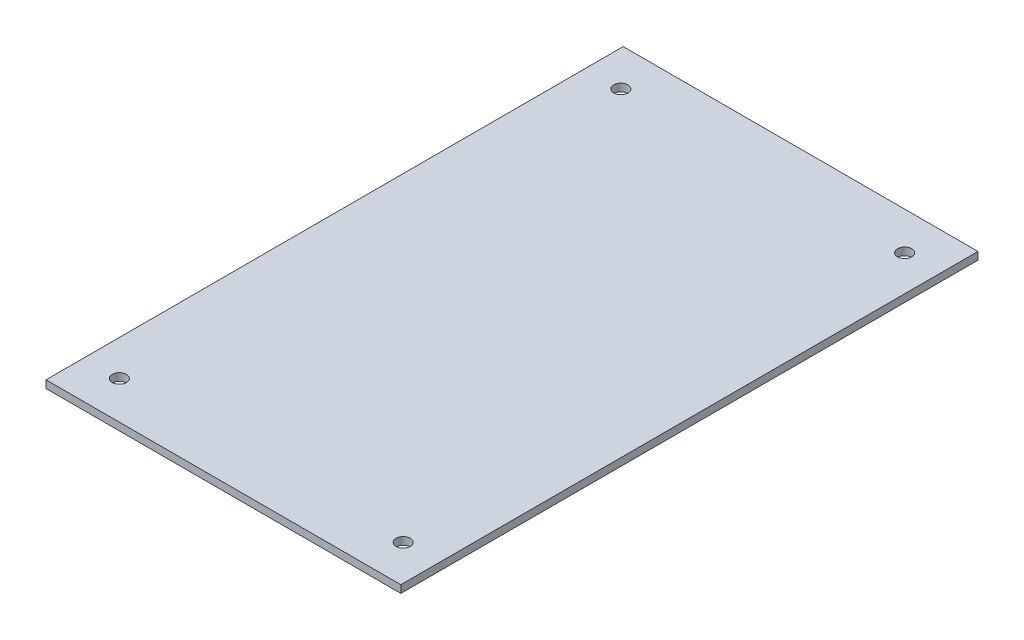
ISO-10303-21;
HEADER;
FILE_DESCRIPTION(('STEP AP214'),'2;1');
FILE_NAME('part.step','',(''),(''),'','','');
FILE_SCHEMA(('AUTOMOTIVE_DESIGN { 1 0 10303 214 1 1 1 1 }'));
ENDSEC;
DATA;
#1=APPLICATION_CONTEXT('core data for automotive mechanical design processes');
#2=APPLICATION_PROTOCOL_DEFINITION('international standard','automotive_design',2000,#1);
#3=PRODUCT_CONTEXT('',#1,'mechanical');
#4=PRODUCT('Part','Part','',(#3));
#5=PRODUCT_RELATED_PRODUCT_CATEGORY('part','',(#4));
#6=PRODUCT_DEFINITION_FORMATION('','',#4);
#7=PRODUCT_DEFINITION_CONTEXT('part definition',#1,'design');
#8=PRODUCT_DEFINITION('design','',#6,#7);
#9=PRODUCT_DEFINITION_SHAPE('','',#8);
#10=(LENGTH_UNIT() NAMED_UNIT(*) SI_UNIT(.MILLI.,.METRE.));
#11=(NAMED_UNIT(*) PLANE_ANGLE_UNIT() SI_UNIT($,.RADIAN.));
#12=(NAMED_UNIT(*) SI_UNIT($,.STERADIAN.) SOLID_ANGLE_UNIT());
#13=UNCERTAINTY_MEASURE_WITH_UNIT(LENGTH_MEASURE(1.E-05),#10,'distance_accuracy_value','');
#14=(GEOMETRIC_REPRESENTATION_CONTEXT(3) GLOBAL_UNCERTAINTY_ASSIGNED_CONTEXT((#13)) GLOBAL_UNIT_ASSIGNED_CONTEXT((#10,
#11,#12)) REPRESENTATION_CONTEXT('',''));
#15=CARTESIAN_POINT('',(0.,0.,0.));
#16=DIRECTION('',(0.,0.,1.));
#17=DIRECTION('',(1.,0.,0.));
#18=AXIS2_PLACEMENT_3D('',#15,#16,#17);
#19=CARTESIAN_POINT('',(-37.5,0.,61.));
#20=DIRECTION('',(0.,1.,0.));
#21=DIRECTION('',(0.,0.,1.));
#22=AXIS2_PLACEMENT_3D('',#19,#20,#21);
#23=PLANE('',#22);
#24=DIRECTION('',(0.,0.,-1.));
#25=VECTOR('',#24,1.);
#26=CARTESIAN_POINT('',(37.5,0.,-61.));
#27=LINE('',#26,#25);
#28=CARTESIAN_POINT('',(37.5,0.,-61.));
#29=VERTEX_POINT('',#28);
#30=CARTESIAN_POINT('',(37.5,0.,61.));
#31=VERTEX_POINT('',#30);
#32=EDGE_CURVE('E58',#29,#31,#27,.F.);
#33=ORIENTED_EDGE('',*,*,#32,.F.);
#34=DIRECTION('',(-1.,0.,0.));
#35=VECTOR('',#34,1.);
#36=CARTESIAN_POINT('',(-37.5,0.,-61.));
#37=LINE('',#36,#35);
#38=CARTESIAN_POINT('',(-37.5,0.,-61.));
#39=VERTEX_POINT('',#38);
#40=EDGE_CURVE('E53',#39,#29,#37,.F.);
#41=ORIENTED_EDGE('',*,*,#40,.F.);
#42=DIRECTION('',(0.,0.,1.));
#43=VECTOR('',#42,1.);
#44=CARTESIAN_POINT('',(-37.5,0.,-61.));
#45=LINE('',#44,#43);
#46=CARTESIAN_POINT('',(-37.5,0.,61.));
#47=VERTEX_POINT('',#46);
#48=EDGE_CURVE('E71',#47,#39,#45,.F.);
#49=ORIENTED_EDGE('',*,*,#48,.F.);
#50=DIRECTION('',(1.,0.,0.));
#51=VECTOR('',#50,1.);
#52=CARTESIAN_POINT('',(-37.5,0.,61.));
#53=LINE('',#52,#51);
#54=EDGE_CURVE('E67',#31,#47,#53,.F.);
#55=ORIENTED_EDGE('',*,*,#54,.F.);
#56=EDGE_LOOP('',(#33,#41,#49,#55));
#57=FACE_BOUND('',#56,.T.);
#58=CARTESIAN_POINT('',(-30.,0.,-53.));
#59=DIRECTION('',(0.,1.,0.));
#60=DIRECTION('',(0.,0.,1.));
#61=AXIS2_PLACEMENT_3D('',#58,#59,#60);
#62=CIRCLE('',#61,1.5);
#63=CARTESIAN_POINT('',(-30.,0.,-51.5));
#64=VERTEX_POINT('',#63);
#65=EDGE_CURVE('E75',#64,#64,#62,.F.);
#66=ORIENTED_EDGE('',*,*,#65,.T.);
#67=EDGE_LOOP('',(#66));
#68=FACE_BOUND('',#67,.T.);
#69=CARTESIAN_POINT('',(-30.,0.,53.));
#70=DIRECTION('',(0.,1.,0.));
#71=DIRECTION('',(0.,0.,1.));
#72=AXIS2_PLACEMENT_3D('',#69,#70,#71);
#73=CIRCLE('',#72,1.5);
#74=CARTESIAN_POINT('',(-30.,0.,54.5));
#75=VERTEX_POINT('',#74);
#76=EDGE_CURVE('E99',#75,#75,#73,.F.);
#77=ORIENTED_EDGE('',*,*,#76,.T.);
#78=EDGE_LOOP('',(#77));
#79=FACE_BOUND('',#78,.T.);
#80=CARTESIAN_POINT('',(30.,0.,53.));
#81=DIRECTION('',(0.,1.,0.));
#82=DIRECTION('',(0.,0.,1.));
#83=AXIS2_PLACEMENT_3D('',#80,#81,#82);
#84=CIRCLE('',#83,1.50000000000001);
#85=CARTESIAN_POINT('',(30.,0.,54.5));
#86=VERTEX_POINT('',#85);
#87=EDGE_CURVE('E101',#86,#86,#84,.F.);
#88=ORIENTED_EDGE('',*,*,#87,.T.);
#89=EDGE_LOOP('',(#88));
#90=FACE_BOUND('',#89,.T.);
#91=CARTESIAN_POINT('',(30.,0.,-53.));
#92=DIRECTION('',(0.,1.,0.));
#93=DIRECTION('',(0.,0.,1.));
#94=AXIS2_PLACEMENT_3D('',#91,#92,#93);
#95=CIRCLE('',#94,1.5);
#96=CARTESIAN_POINT('',(30.,0.,-51.5));
#97=VERTEX_POINT('',#96);
#98=EDGE_CURVE('E20',#97,#97,#95,.F.);
#99=ORIENTED_EDGE('',*,*,#98,.T.);
#100=EDGE_LOOP('',(#99));
#101=FACE_BOUND('',#100,.T.);
#102=ADVANCED_FACE('F17',(#57,#68,#79,#90,#101),#23,.T.);
#103=CARTESIAN_POINT('',(30.,-1.6,-53.));
#104=DIRECTION('',(0.,1.,0.));
#105=DIRECTION('',(0.,0.,1.));
#106=AXIS2_PLACEMENT_3D('',#103,#104,#105);
#107=CYLINDRICAL_SURFACE('',#106,1.5);
#108=CARTESIAN_POINT('',(30.,-1.6,-53.));
#109=DIRECTION('',(0.,1.,0.));
#110=DIRECTION('',(0.,0.,1.));
#111=AXIS2_PLACEMENT_3D('',#108,#109,#110);
#112=CIRCLE('',#111,1.5);
#113=CARTESIAN_POINT('',(30.,-1.6,-51.5));
#114=VERTEX_POINT('',#113);
#115=EDGE_CURVE('E93',#114,#114,#112,.F.);
#116=ORIENTED_EDGE('',*,*,#115,.T.);
#117=EDGE_LOOP('',(#116));
#118=FACE_BOUND('',#117,.T.);
#119=ORIENTED_EDGE('',*,*,#98,.F.);
#120=EDGE_LOOP('',(#119));
#121=FACE_BOUND('',#120,.T.);
#122=ADVANCED_FACE('F109',(#118,#121),#107,.F.);
#123=CARTESIAN_POINT('',(30.,-1.6,53.));
#124=DIRECTION('',(0.,1.,0.));
#125=DIRECTION('',(0.,0.,1.));
#126=AXIS2_PLACEMENT_3D('',#123,#124,#125);
#127=CYLINDRICAL_SURFACE('',#126,1.50000000000001);
#128=CARTESIAN_POINT('',(30.,-1.6,53.));
#129=DIRECTION('',(0.,1.,0.));
#130=DIRECTION('',(0.,0.,1.));
#131=AXIS2_PLACEMENT_3D('',#128,#129,#130);
#132=CIRCLE('',#131,1.50000000000001);
#133=CARTESIAN_POINT('',(30.,-1.6,54.5));
#134=VERTEX_POINT('',#133);
#135=EDGE_CURVE('E90',#134,#134,#132,.F.);
#136=ORIENTED_EDGE('',*,*,#135,.T.);
#137=EDGE_LOOP('',(#136));
#138=FACE_BOUND('',#137,.T.);
#139=ORIENTED_EDGE('',*,*,#87,.F.);
#140=EDGE_LOOP('',(#139));
#141=FACE_BOUND('',#140,.T.);
#142=ADVANCED_FACE('F111',(#138,#141),#127,.F.);
#143=CARTESIAN_POINT('',(-30.,-1.6,53.));
#144=DIRECTION('',(0.,1.,0.));
#145=DIRECTION('',(0.,0.,1.));
#146=AXIS2_PLACEMENT_3D('',#143,#144,#145);
#147=CYLINDRICAL_SURFACE('',#146,1.5);
#148=CARTESIAN_POINT('',(-30.,-1.6,53.));
#149=DIRECTION('',(0.,1.,0.));
#150=DIRECTION('',(0.,0.,1.));
#151=AXIS2_PLACEMENT_3D('',#148,#149,#150);
#152=CIRCLE('',#151,1.5);
#153=CARTESIAN_POINT('',(-30.,-1.6,54.5));
#154=VERTEX_POINT('',#153);
#155=EDGE_CURVE('E87',#154,#154,#152,.F.);
#156=ORIENTED_EDGE('',*,*,#155,.T.);
#157=EDGE_LOOP('',(#156));
#158=FACE_BOUND('',#157,.T.);
#159=ORIENTED_EDGE('',*,*,#76,.F.);
#160=EDGE_LOOP('',(#159));
#161=FACE_BOUND('',#160,.T.);
#162=ADVANCED_FACE('F118',(#158,#161),#147,.F.);
#163=CARTESIAN_POINT('',(-30.,-1.6,-53.));
#164=DIRECTION('',(0.,1.,0.));
#165=DIRECTION('',(0.,0.,1.));
#166=AXIS2_PLACEMENT_3D('',#163,#164,#165);
#167=CYLINDRICAL_SURFACE('',#166,1.5);
#168=CARTESIAN_POINT('',(-30.,-1.6,-53.));
#169=DIRECTION('',(0.,1.,0.));
#170=DIRECTION('',(0.,0.,1.));
#171=AXIS2_PLACEMENT_3D('',#168,#169,#170);
#172=CIRCLE('',#171,1.5);
#173=CARTESIAN_POINT('',(-30.,-1.6,-51.5));
#174=VERTEX_POINT('',#173);
#175=EDGE_CURVE('E84',#174,#174,#172,.F.);
#176=ORIENTED_EDGE('',*,*,#175,.T.);
#177=EDGE_LOOP('',(#176));
#178=FACE_BOUND('',#177,.T.);
#179=ORIENTED_EDGE('',*,*,#65,.F.);
#180=EDGE_LOOP('',(#179));
#181=FACE_BOUND('',#180,.T.);
#182=ADVANCED_FACE('F140',(#178,#181),#167,.F.);
#183=CARTESIAN_POINT('',(-37.5,-1.6,61.));
#184=DIRECTION('',(0.,0.,1.));
#185=DIRECTION('',(1.,0.,0.));
#186=AXIS2_PLACEMENT_3D('',#183,#184,#185);
#187=PLANE('',#186);
#188=DIRECTION('',(1.,0.,0.));
#189=VECTOR('',#188,1.);
#190=CARTESIAN_POINT('',(-37.5,-1.6,61.));
#191=LINE('',#190,#189);
#192=CARTESIAN_POINT('',(-37.5,-1.6,61.));
#193=VERTEX_POINT('',#192);
#194=CARTESIAN_POINT('',(37.5,-1.6,61.));
#195=VERTEX_POINT('',#194);
#196=EDGE_CURVE('E79',#193,#195,#191,.T.);
#197=ORIENTED_EDGE('',*,*,#196,.T.);
#198=DIRECTION('',(0.,1.,0.));
#199=VECTOR('',#198,1.);
#200=CARTESIAN_POINT('',(37.5,-1.6,61.));
#201=LINE('',#200,#199);
#202=EDGE_CURVE('E63',#31,#195,#201,.F.);
#203=ORIENTED_EDGE('',*,*,#202,.F.);
#204=ORIENTED_EDGE('',*,*,#54,.T.);
#205=DIRECTION('',(0.,1.,0.));
#206=VECTOR('',#205,1.);
#207=CARTESIAN_POINT('',(-37.5,-1.6,61.));
#208=LINE('',#207,#206);
#209=EDGE_CURVE('E96',#193,#47,#208,.T.);
#210=ORIENTED_EDGE('',*,*,#209,.F.);
#211=EDGE_LOOP('',(#197,#203,#204,#210));
#212=FACE_BOUND('',#211,.T.);
#213=ADVANCED_FACE('F78',(#212),#187,.T.);
#214=CARTESIAN_POINT('',(37.5,-1.6,-61.));
#215=DIRECTION('',(1.,0.,0.));
#216=DIRECTION('',(0.,0.,-1.));
#217=AXIS2_PLACEMENT_3D('',#214,#215,#216);
#218=PLANE('',#217);
#219=DIRECTION('',(0.,0.,1.));
#220=VECTOR('',#219,1.);
#221=CARTESIAN_POINT('',(37.5,-1.6,61.));
#222=LINE('',#221,#220);
#223=CARTESIAN_POINT('',(37.5,-1.6,-61.));
#224=VERTEX_POINT('',#223);
#225=EDGE_CURVE('E223',#195,#224,#222,.F.);
#226=ORIENTED_EDGE('',*,*,#225,.T.);
#227=DIRECTION('',(0.,1.,0.));
#228=VECTOR('',#227,1.);
#229=CARTESIAN_POINT('',(37.5,-1.6,-61.));
#230=LINE('',#229,#228);
#231=EDGE_CURVE('E65',#29,#224,#230,.F.);
#232=ORIENTED_EDGE('',*,*,#231,.F.);
#233=ORIENTED_EDGE('',*,*,#32,.T.);
#234=ORIENTED_EDGE('',*,*,#202,.T.);
#235=EDGE_LOOP('',(#226,#232,#233,#234));
#236=FACE_BOUND('',#235,.T.);
#237=ADVANCED_FACE('F61',(#236),#218,.T.);
#238=CARTESIAN_POINT('',(-37.5,-1.6,-61.));
#239=DIRECTION('',(0.,0.,-1.));
#240=DIRECTION('',(-1.,0.,0.));
#241=AXIS2_PLACEMENT_3D('',#238,#239,#240);
#242=PLANE('',#241);
#243=DIRECTION('',(1.,0.,0.));
#244=VECTOR('',#243,1.);
#245=CARTESIAN_POINT('',(-37.5,-1.6,-61.));
#246=LINE('',#245,#244);
#247=CARTESIAN_POINT('',(-37.5,-1.6,-61.));
#248=VERTEX_POINT('',#247);
#249=EDGE_CURVE('E26',#224,#248,#246,.F.);
#250=ORIENTED_EDGE('',*,*,#249,.T.);
#251=DIRECTION('',(0.,1.,0.));
#252=VECTOR('',#251,1.);
#253=CARTESIAN_POINT('',(-37.5,-1.6,-61.));
#254=LINE('',#253,#252);
#255=EDGE_CURVE('E34',#39,#248,#254,.F.);
#256=ORIENTED_EDGE('',*,*,#255,.F.);
#257=ORIENTED_EDGE('',*,*,#40,.T.);
#258=ORIENTED_EDGE('',*,*,#231,.T.);
#259=EDGE_LOOP('',(#250,#256,#257,#258));
#260=FACE_BOUND('',#259,.T.);
#261=ADVANCED_FACE('F129',(#260),#242,.T.);
#262=CARTESIAN_POINT('',(-37.5,-1.6,-61.));
#263=DIRECTION('',(-1.,0.,0.));
#264=DIRECTION('',(0.,0.,1.));
#265=AXIS2_PLACEMENT_3D('',#262,#263,#264);
#266=PLANE('',#265);
#267=DIRECTION('',(0.,0.,1.));
#268=VECTOR('',#267,1.);
#269=CARTESIAN_POINT('',(-37.5,-1.6,61.));
#270=LINE('',#269,#268);
#271=EDGE_CURVE('E11',#248,#193,#270,.T.);
#272=ORIENTED_EDGE('',*,*,#271,.T.);
#273=ORIENTED_EDGE('',*,*,#209,.T.);
#274=ORIENTED_EDGE('',*,*,#48,.T.);
#275=ORIENTED_EDGE('',*,*,#255,.T.);
#276=EDGE_LOOP('',(#272,#273,#274,#275));
#277=FACE_BOUND('',#276,.T.);
#278=ADVANCED_FACE('F123',(#277),#266,.T.);
#279=CARTESIAN_POINT('',(-37.5,-1.6,61.));
#280=DIRECTION('',(0.,1.,0.));
#281=DIRECTION('',(0.,0.,1.));
#282=AXIS2_PLACEMENT_3D('',#279,#280,#281);
#283=PLANE('',#282);
#284=ORIENTED_EDGE('',*,*,#249,.F.);
#285=ORIENTED_EDGE('',*,*,#225,.F.);
#286=ORIENTED_EDGE('',*,*,#196,.F.);
#287=ORIENTED_EDGE('',*,*,#271,.F.);
#288=EDGE_LOOP('',(#284,#285,#286,#287));
#289=FACE_BOUND('',#288,.T.);
#290=ORIENTED_EDGE('',*,*,#175,.F.);
#291=EDGE_LOOP('',(#290));
#292=FACE_BOUND('',#291,.T.);
#293=ORIENTED_EDGE('',*,*,#155,.F.);
#294=EDGE_LOOP('',(#293));
#295=FACE_BOUND('',#294,.T.);
#296=ORIENTED_EDGE('',*,*,#135,.F.);
#297=EDGE_LOOP('',(#296));
#298=FACE_BOUND('',#297,.T.);
#299=ORIENTED_EDGE('',*,*,#115,.F.);
#300=EDGE_LOOP('',(#299));
#301=FACE_BOUND('',#300,.T.);
#302=ADVANCED_FACE('F121',(#289,#292,#295,#298,#301),#283,.F.);
#303=CLOSED_SHELL('',(#102,#122,#142,#162,#182,#213,#237,#261,#278,#302));
#304=MANIFOLD_SOLID_BREP('B1',#303);
#305=ADVANCED_BREP_SHAPE_REPRESENTATION('',(#18,#304),#14);
#306=SHAPE_DEFINITION_REPRESENTATION(#9,#305);
ENDSEC;
END-ISO-10303-21;
